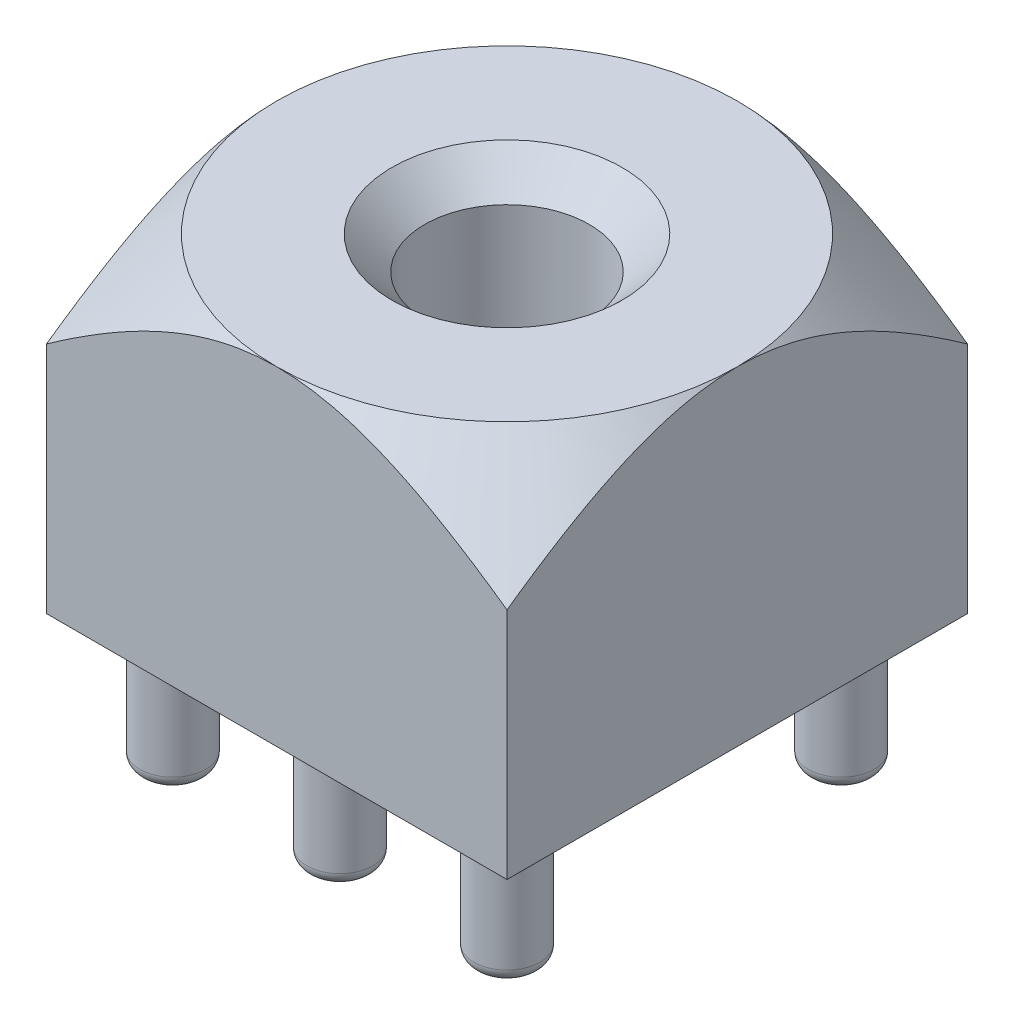
ISO-10303-21;
HEADER;
FILE_DESCRIPTION(('STEP AP214'),'2;1');
FILE_NAME('part.step','',(''),(''),'','','');
FILE_SCHEMA(('AUTOMOTIVE_DESIGN { 1 0 10303 214 1 1 1 1 }'));
ENDSEC;
DATA;
#1=APPLICATION_CONTEXT('core data for automotive mechanical design processes');
#2=APPLICATION_PROTOCOL_DEFINITION('international standard','automotive_design',2000,#1);
#3=PRODUCT_CONTEXT('',#1,'mechanical');
#4=PRODUCT('Part','Part','',(#3));
#5=PRODUCT_RELATED_PRODUCT_CATEGORY('part','',(#4));
#6=PRODUCT_DEFINITION_FORMATION('','',#4);
#7=PRODUCT_DEFINITION_CONTEXT('part definition',#1,'design');
#8=PRODUCT_DEFINITION('design','',#6,#7);
#9=PRODUCT_DEFINITION_SHAPE('','',#8);
#10=(LENGTH_UNIT() NAMED_UNIT(*) SI_UNIT(.MILLI.,.METRE.));
#11=(NAMED_UNIT(*) PLANE_ANGLE_UNIT() SI_UNIT($,.RADIAN.));
#12=(NAMED_UNIT(*) SI_UNIT($,.STERADIAN.) SOLID_ANGLE_UNIT());
#13=UNCERTAINTY_MEASURE_WITH_UNIT(LENGTH_MEASURE(1.E-05),#10,'distance_accuracy_value','');
#14=(GEOMETRIC_REPRESENTATION_CONTEXT(3) GLOBAL_UNCERTAINTY_ASSIGNED_CONTEXT((#13)) GLOBAL_UNIT_ASSIGNED_CONTEXT((#10,
#11,#12)) REPRESENTATION_CONTEXT('',''));
#15=CARTESIAN_POINT('',(0.,0.,0.));
#16=DIRECTION('',(0.,0.,1.));
#17=DIRECTION('',(1.,0.,0.));
#18=AXIS2_PLACEMENT_3D('',#15,#16,#17);
#19=CARTESIAN_POINT('',(2.54,-7.,2.54));
#20=DIRECTION('',(0.,-1.,0.));
#21=DIRECTION('',(0.,0.,-1.));
#22=AXIS2_PLACEMENT_3D('',#19,#20,#21);
#23=PLANE('',#22);
#24=CARTESIAN_POINT('',(2.54,-7.,2.54));
#25=DIRECTION('',(0.,1.,0.));
#26=DIRECTION('',(0.,0.,1.));
#27=AXIS2_PLACEMENT_3D('',#24,#25,#26);
#28=CIRCLE('',#27,0.3);
#29=CARTESIAN_POINT('',(2.54,-7.,2.84));
#30=VERTEX_POINT('',#29);
#31=CARTESIAN_POINT('',(2.54,-7.,2.24));
#32=VERTEX_POINT('',#31);
#33=EDGE_CURVE('E494',#30,#32,#28,.T.);
#34=ORIENTED_EDGE('',*,*,#33,.F.);
#35=CARTESIAN_POINT('',(2.54,-7.,2.54));
#36=DIRECTION('',(0.,1.,0.));
#37=DIRECTION('',(0.,0.,-1.));
#38=AXIS2_PLACEMENT_3D('',#35,#36,#37);
#39=CIRCLE('',#38,0.3);
#40=EDGE_CURVE('E503',#32,#30,#39,.T.);
#41=ORIENTED_EDGE('',*,*,#40,.F.);
#42=EDGE_LOOP('',(#34,#41));
#43=FACE_BOUND('',#42,.T.);
#44=ADVANCED_FACE('F17',(#43),#23,.T.);
#45=CARTESIAN_POINT('',(-2.54,-7.,2.54));
#46=DIRECTION('',(0.,-1.,0.));
#47=DIRECTION('',(0.,0.,-1.));
#48=AXIS2_PLACEMENT_3D('',#45,#46,#47);
#49=PLANE('',#48);
#50=CARTESIAN_POINT('',(-2.54,-7.,2.54));
#51=DIRECTION('',(0.,1.,0.));
#52=DIRECTION('',(0.,0.,1.));
#53=AXIS2_PLACEMENT_3D('',#50,#51,#52);
#54=CIRCLE('',#53,0.3);
#55=CARTESIAN_POINT('',(-2.54,-7.,2.84));
#56=VERTEX_POINT('',#55);
#57=CARTESIAN_POINT('',(-2.54,-7.,2.24));
#58=VERTEX_POINT('',#57);
#59=EDGE_CURVE('E455',#56,#58,#54,.T.);
#60=ORIENTED_EDGE('',*,*,#59,.F.);
#61=CARTESIAN_POINT('',(-2.54,-7.,2.54));
#62=DIRECTION('',(0.,1.,0.));
#63=DIRECTION('',(0.,0.,-1.));
#64=AXIS2_PLACEMENT_3D('',#61,#62,#63);
#65=CIRCLE('',#64,0.3);
#66=EDGE_CURVE('E439',#58,#56,#65,.T.);
#67=ORIENTED_EDGE('',*,*,#66,.F.);
#68=EDGE_LOOP('',(#60,#67));
#69=FACE_BOUND('',#68,.T.);
#70=ADVANCED_FACE('F461',(#69),#49,.T.);
#71=CARTESIAN_POINT('',(0.,-7.,2.54));
#72=DIRECTION('',(0.,-1.,0.));
#73=DIRECTION('',(0.,0.,-1.));
#74=AXIS2_PLACEMENT_3D('',#71,#72,#73);
#75=PLANE('',#74);
#76=CARTESIAN_POINT('',(0.,-7.,2.54));
#77=DIRECTION('',(0.,1.,0.));
#78=DIRECTION('',(0.,0.,1.));
#79=AXIS2_PLACEMENT_3D('',#76,#77,#78);
#80=CIRCLE('',#79,0.3);
#81=CARTESIAN_POINT('',(0.,-7.,2.84));
#82=VERTEX_POINT('',#81);
#83=CARTESIAN_POINT('',(0.,-7.,2.24));
#84=VERTEX_POINT('',#83);
#85=EDGE_CURVE('E307',#82,#84,#80,.T.);
#86=ORIENTED_EDGE('',*,*,#85,.F.);
#87=CARTESIAN_POINT('',(0.,-7.,2.54));
#88=DIRECTION('',(0.,1.,0.));
#89=DIRECTION('',(0.,0.,-1.));
#90=AXIS2_PLACEMENT_3D('',#87,#88,#89);
#91=CIRCLE('',#90,0.3);
#92=EDGE_CURVE('E435',#84,#82,#91,.T.);
#93=ORIENTED_EDGE('',*,*,#92,.F.);
#94=EDGE_LOOP('',(#86,#93));
#95=FACE_BOUND('',#94,.T.);
#96=ADVANCED_FACE('F469',(#95),#75,.T.);
#97=CARTESIAN_POINT('',(0.,0.,0.));
#98=DIRECTION('',(0.,1.,0.));
#99=DIRECTION('',(0.,0.,1.));
#100=AXIS2_PLACEMENT_3D('',#97,#98,#99);
#101=CONICAL_SURFACE('',#100,1.74999999995862,0.785398163340605);
#102=CARTESIAN_POINT('',(0.,0.,0.));
#103=DIRECTION('',(0.,1.,0.));
#104=DIRECTION('',(0.,0.,1.));
#105=AXIS2_PLACEMENT_3D('',#102,#103,#104);
#106=CIRCLE('',#105,1.74999999995862);
#107=CARTESIAN_POINT('',(0.,0.,1.74999999995862));
#108=VERTEX_POINT('',#107);
#109=EDGE_CURVE('E514',#108,#108,#106,.F.);
#110=ORIENTED_EDGE('',*,*,#109,.F.);
#111=EDGE_LOOP('',(#110));
#112=FACE_BOUND('',#111,.T.);
#113=CARTESIAN_POINT('',(0.,-0.499999999999994,0.));
#114=DIRECTION('',(0.,1.,0.));
#115=DIRECTION('',(0.,0.,1.));
#116=AXIS2_PLACEMENT_3D('',#113,#114,#115);
#117=CIRCLE('',#116,1.24999999999999);
#118=CARTESIAN_POINT('',(0.,-0.499999999999994,1.24999999999999));
#119=VERTEX_POINT('',#118);
#120=EDGE_CURVE('E121',#119,#119,#117,.F.);
#121=ORIENTED_EDGE('',*,*,#120,.T.);
#122=EDGE_LOOP('',(#121));
#123=FACE_BOUND('',#122,.T.);
#124=ADVANCED_FACE('F725',(#112,#123),#101,.F.);
#125=CARTESIAN_POINT('',(-3.5,0.,3.5));
#126=DIRECTION('',(0.,1.,0.));
#127=DIRECTION('',(0.,0.,1.));
#128=AXIS2_PLACEMENT_3D('',#125,#126,#127);
#129=PLANE('',#128);
#130=CARTESIAN_POINT('',(0.,0.,0.));
#131=DIRECTION('',(0.,-1.,0.));
#132=DIRECTION('',(0.,0.,-1.));
#133=AXIS2_PLACEMENT_3D('',#130,#131,#132);
#134=CIRCLE('',#133,3.49999999997408);
#135=CARTESIAN_POINT('',(0.,-1.29599677224441E-11,-3.49999999998704));
#136=VERTEX_POINT('',#135);
#137=CARTESIAN_POINT('',(3.49999999998704,-1.29598728578973E-11,0.));
#138=VERTEX_POINT('',#137);
#139=EDGE_CURVE('E106',#136,#138,#134,.T.);
#140=ORIENTED_EDGE('',*,*,#139,.F.);
#141=CARTESIAN_POINT('',(0.,0.,0.));
#142=DIRECTION('',(0.,-1.,0.));
#143=DIRECTION('',(0.,0.,-1.));
#144=AXIS2_PLACEMENT_3D('',#141,#142,#143);
#145=CIRCLE('',#144,3.49999999997408);
#146=CARTESIAN_POINT('',(-3.49999999998704,-1.29599812781145E-11,0.));
#147=VERTEX_POINT('',#146);
#148=EDGE_CURVE('E127',#147,#136,#145,.T.);
#149=ORIENTED_EDGE('',*,*,#148,.F.);
#150=CARTESIAN_POINT('',(0.,0.,0.));
#151=DIRECTION('',(0.,-1.,0.));
#152=DIRECTION('',(0.,0.,-1.));
#153=AXIS2_PLACEMENT_3D('',#150,#151,#152);
#154=CIRCLE('',#153,3.49999999997408);
#155=CARTESIAN_POINT('',(0.,-1.29599677255874E-11,3.49999999998704));
#156=VERTEX_POINT('',#155);
#157=EDGE_CURVE('E124',#156,#147,#154,.T.);
#158=ORIENTED_EDGE('',*,*,#157,.F.);
#159=CARTESIAN_POINT('',(0.,0.,0.));
#160=DIRECTION('',(0.,-1.,0.));
#161=DIRECTION('',(0.,0.,-1.));
#162=AXIS2_PLACEMENT_3D('',#159,#160,#161);
#163=CIRCLE('',#162,3.49999999997408);
#164=EDGE_CURVE('E112',#138,#156,#163,.T.);
#165=ORIENTED_EDGE('',*,*,#164,.F.);
#166=EDGE_LOOP('',(#140,#149,#158,#165));
#167=FACE_BOUND('',#166,.T.);
#168=ORIENTED_EDGE('',*,*,#109,.T.);
#169=EDGE_LOOP('',(#168));
#170=FACE_BOUND('',#169,.T.);
#171=ADVANCED_FACE('F125',(#167,#170),#129,.T.);
#172=CARTESIAN_POINT('',(0.,-7.,-2.54));
#173=DIRECTION('',(0.,1.,0.));
#174=DIRECTION('',(0.,0.,1.));
#175=AXIS2_PLACEMENT_3D('',#172,#173,#174);
#176=PLANE('',#175);
#177=CARTESIAN_POINT('',(0.,-7.,-2.54));
#178=DIRECTION('',(0.,1.,0.));
#179=DIRECTION('',(0.,0.,1.));
#180=AXIS2_PLACEMENT_3D('',#177,#178,#179);
#181=CIRCLE('',#180,0.3);
#182=CARTESIAN_POINT('',(0.,-7.,-2.24));
#183=VERTEX_POINT('',#182);
#184=CARTESIAN_POINT('',(0.,-7.,-2.84));
#185=VERTEX_POINT('',#184);
#186=EDGE_CURVE('E294',#183,#185,#181,.T.);
#187=ORIENTED_EDGE('',*,*,#186,.F.);
#188=CARTESIAN_POINT('',(0.,-7.,-2.54));
#189=DIRECTION('',(0.,1.,0.));
#190=DIRECTION('',(0.,0.,-1.));
#191=AXIS2_PLACEMENT_3D('',#188,#189,#190);
#192=CIRCLE('',#191,0.3);
#193=EDGE_CURVE('E132',#185,#183,#192,.T.);
#194=ORIENTED_EDGE('',*,*,#193,.F.);
#195=EDGE_LOOP('',(#187,#194));
#196=FACE_BOUND('',#195,.T.);
#197=ADVANCED_FACE('F709',(#196),#176,.F.);
#198=CARTESIAN_POINT('',(-2.54,-7.,-2.54));
#199=DIRECTION('',(0.,1.,0.));
#200=DIRECTION('',(0.,0.,1.));
#201=AXIS2_PLACEMENT_3D('',#198,#199,#200);
#202=PLANE('',#201);
#203=CARTESIAN_POINT('',(-2.54,-7.,-2.54));
#204=DIRECTION('',(0.,1.,0.));
#205=DIRECTION('',(0.,0.,1.));
#206=AXIS2_PLACEMENT_3D('',#203,#204,#205);
#207=CIRCLE('',#206,0.3);
#208=CARTESIAN_POINT('',(-2.54,-7.,-2.24));
#209=VERTEX_POINT('',#208);
#210=CARTESIAN_POINT('',(-2.54,-7.,-2.84));
#211=VERTEX_POINT('',#210);
#212=EDGE_CURVE('E281',#209,#211,#207,.T.);
#213=ORIENTED_EDGE('',*,*,#212,.F.);
#214=CARTESIAN_POINT('',(-2.54,-7.,-2.54));
#215=DIRECTION('',(0.,1.,0.));
#216=DIRECTION('',(0.,0.,-1.));
#217=AXIS2_PLACEMENT_3D('',#214,#215,#216);
#218=CIRCLE('',#217,0.3);
#219=EDGE_CURVE('E819',#211,#209,#218,.T.);
#220=ORIENTED_EDGE('',*,*,#219,.F.);
#221=EDGE_LOOP('',(#213,#220));
#222=FACE_BOUND('',#221,.T.);
#223=ADVANCED_FACE('F701',(#222),#202,.F.);
#224=CARTESIAN_POINT('',(2.54,-7.,-2.54));
#225=DIRECTION('',(0.,1.,0.));
#226=DIRECTION('',(0.,0.,1.));
#227=AXIS2_PLACEMENT_3D('',#224,#225,#226);
#228=PLANE('',#227);
#229=CARTESIAN_POINT('',(2.54,-7.,-2.54));
#230=DIRECTION('',(0.,1.,0.));
#231=DIRECTION('',(0.,0.,1.));
#232=AXIS2_PLACEMENT_3D('',#229,#230,#231);
#233=CIRCLE('',#232,0.3);
#234=CARTESIAN_POINT('',(2.54,-7.,-2.24));
#235=VERTEX_POINT('',#234);
#236=CARTESIAN_POINT('',(2.54,-7.,-2.84));
#237=VERTEX_POINT('',#236);
#238=EDGE_CURVE('E512',#235,#237,#233,.T.);
#239=ORIENTED_EDGE('',*,*,#238,.F.);
#240=CARTESIAN_POINT('',(2.54,-7.,-2.54));
#241=DIRECTION('',(0.,1.,0.));
#242=DIRECTION('',(0.,0.,-1.));
#243=AXIS2_PLACEMENT_3D('',#240,#241,#242);
#244=CIRCLE('',#243,0.3);
#245=EDGE_CURVE('E339',#237,#235,#244,.T.);
#246=ORIENTED_EDGE('',*,*,#245,.F.);
#247=EDGE_LOOP('',(#239,#246));
#248=FACE_BOUND('',#247,.T.);
#249=ADVANCED_FACE('F348',(#248),#228,.F.);
#250=CARTESIAN_POINT('',(2.54,-6.8,2.54));
#251=DIRECTION('',(0.,-1.,0.));
#252=DIRECTION('',(0.,0.,-1.));
#253=AXIS2_PLACEMENT_3D('',#250,#251,#252);
#254=TOROIDAL_SURFACE('',#253,0.3,0.2);
#255=CARTESIAN_POINT('',(2.54,-6.8,2.54));
#256=DIRECTION('',(0.,1.,0.));
#257=DIRECTION('',(0.,0.,1.));
#258=AXIS2_PLACEMENT_3D('',#255,#256,#257);
#259=CIRCLE('',#258,0.5);
#260=CARTESIAN_POINT('',(2.54,-6.8,3.04));
#261=VERTEX_POINT('',#260);
#262=EDGE_CURVE('E334',#261,#261,#259,.T.);
#263=ORIENTED_EDGE('',*,*,#262,.F.);
#264=EDGE_LOOP('',(#263));
#265=FACE_BOUND('',#264,.T.);
#266=ORIENTED_EDGE('',*,*,#40,.T.);
#267=ORIENTED_EDGE('',*,*,#33,.T.);
#268=EDGE_LOOP('',(#266,#267));
#269=FACE_BOUND('',#268,.T.);
#270=ADVANCED_FACE('F344',(#265,#269),#254,.T.);
#271=CARTESIAN_POINT('',(-2.54,-6.8,2.54));
#272=DIRECTION('',(0.,-1.,0.));
#273=DIRECTION('',(0.,0.,-1.));
#274=AXIS2_PLACEMENT_3D('',#271,#272,#273);
#275=TOROIDAL_SURFACE('',#274,0.3,0.2);
#276=CARTESIAN_POINT('',(-2.54,-6.8,2.54));
#277=DIRECTION('',(0.,1.,0.));
#278=DIRECTION('',(0.,0.,1.));
#279=AXIS2_PLACEMENT_3D('',#276,#277,#278);
#280=CIRCLE('',#279,0.5);
#281=CARTESIAN_POINT('',(-2.54,-6.8,3.04));
#282=VERTEX_POINT('',#281);
#283=EDGE_CURVE('E332',#282,#282,#280,.T.);
#284=ORIENTED_EDGE('',*,*,#283,.F.);
#285=EDGE_LOOP('',(#284));
#286=FACE_BOUND('',#285,.T.);
#287=ORIENTED_EDGE('',*,*,#66,.T.);
#288=ORIENTED_EDGE('',*,*,#59,.T.);
#289=EDGE_LOOP('',(#287,#288));
#290=FACE_BOUND('',#289,.T.);
#291=ADVANCED_FACE('F323',(#286,#290),#275,.T.);
#292=CARTESIAN_POINT('',(0.,-6.8,2.54));
#293=DIRECTION('',(0.,-1.,0.));
#294=DIRECTION('',(0.,0.,-1.));
#295=AXIS2_PLACEMENT_3D('',#292,#293,#294);
#296=TOROIDAL_SURFACE('',#295,0.3,0.2);
#297=CARTESIAN_POINT('',(0.,-6.8,2.54));
#298=DIRECTION('',(0.,1.,0.));
#299=DIRECTION('',(0.,0.,1.));
#300=AXIS2_PLACEMENT_3D('',#297,#298,#299);
#301=CIRCLE('',#300,0.5);
#302=CARTESIAN_POINT('',(0.,-6.8,3.04));
#303=VERTEX_POINT('',#302);
#304=EDGE_CURVE('E147',#303,#303,#301,.T.);
#305=ORIENTED_EDGE('',*,*,#304,.F.);
#306=EDGE_LOOP('',(#305));
#307=FACE_BOUND('',#306,.T.);
#308=ORIENTED_EDGE('',*,*,#92,.T.);
#309=ORIENTED_EDGE('',*,*,#85,.T.);
#310=EDGE_LOOP('',(#308,#309));
#311=FACE_BOUND('',#310,.T.);
#312=ADVANCED_FACE('F313',(#307,#311),#296,.T.);
#313=CARTESIAN_POINT('',(0.,0.,0.));
#314=DIRECTION('',(0.,1.,0.));
#315=DIRECTION('',(0.,0.,1.));
#316=AXIS2_PLACEMENT_3D('',#313,#314,#315);
#317=CYLINDRICAL_SURFACE('',#316,1.24999999999999);
#318=ORIENTED_EDGE('',*,*,#120,.F.);
#319=EDGE_LOOP('',(#318));
#320=FACE_BOUND('',#319,.T.);
#321=CARTESIAN_POINT('',(0.,-4.50000000000728,0.));
#322=DIRECTION('',(0.,-1.,0.));
#323=DIRECTION('',(0.,0.,-1.));
#324=AXIS2_PLACEMENT_3D('',#321,#322,#323);
#325=CIRCLE('',#324,1.24999999997044);
#326=CARTESIAN_POINT('',(0.,-4.50000000000728,-1.24999999997044));
#327=VERTEX_POINT('',#326);
#328=EDGE_CURVE('E144',#327,#327,#325,.T.);
#329=ORIENTED_EDGE('',*,*,#328,.T.);
#330=EDGE_LOOP('',(#329));
#331=FACE_BOUND('',#330,.T.);
#332=ADVANCED_FACE('F228',(#320,#331),#317,.F.);
#333=CARTESIAN_POINT('',(0.,-1.45844589394528,0.));
#334=DIRECTION('',(0.,-1.,0.));
#335=DIRECTION('',(0.,0.,-1.));
#336=AXIS2_PLACEMENT_3D('',#333,#334,#335);
#337=CONICAL_SURFACE('',#336,4.95844589391936,0.785398163397448);
#338=ORIENTED_EDGE('',*,*,#164,.T.);
#339=CARTESIAN_POINT('',(3.49999999998901,-1.44974746832139,3.50000000000366));
#340=CARTESIAN_POINT('',(3.39821366399818,-1.37780035224566,3.50000000000132));
#341=CARTESIAN_POINT('',(3.29569972899953,-1.30685700247901,3.50000000000035));
#342=CARTESIAN_POINT('',(3.08889737231007,-1.16748097128362,3.49999999999965));
#343=CARTESIAN_POINT('',(2.9846079761707,-1.09904973819861,3.4999999999999));
#344=CARTESIAN_POINT('',(2.77268890202154,-0.964419059791529,3.5000000000001));
#345=CARTESIAN_POINT('',(2.66503346830753,-0.898259921312427,3.50000000000003));
#346=CARTESIAN_POINT('',(2.44740446526764,-0.769901453770757,3.49999999999997));
#347=CARTESIAN_POINT('',(2.33743130242969,-0.707701437916691,3.49999999999999));
#348=CARTESIAN_POINT('',(2.12018775598007,-0.591114496218378,3.50000000000001));
#349=CARTESIAN_POINT('',(2.01304365925041,-0.536495241185325,3.5));
#350=CARTESIAN_POINT('',(1.79611690713829,-0.432802357168697,3.5));
#351=CARTESIAN_POINT('',(1.68633373209592,-0.383729831417964,3.5));
#352=CARTESIAN_POINT('',(1.35377147329278,-0.247279642952584,3.5));
#353=CARTESIAN_POINT('',(1.12649455380514,-0.169945901936522,3.5));
#354=CARTESIAN_POINT('',(0.821873706040195,-0.0945117383772291,3.5));
#355=CARTESIAN_POINT('',(0.748833760110536,-0.078483862848356,3.5));
#356=CARTESIAN_POINT('',(0.601913605519759,-0.0506478126324783,3.5));
#357=CARTESIAN_POINT('',(0.52803311786151,-0.0388410838696342,3.5));
#358=CARTESIAN_POINT('',(0.378634177556263,-0.0196321814308574,3.5));
#359=CARTESIAN_POINT('',(0.303107346656419,-0.012294763165499,3.5));
#360=CARTESIAN_POINT('',(0.15172403513332,-0.00246621394792665,3.5));
#361=CARTESIAN_POINT('',(0.0758674857147034,2.38516451155393E-05,3.5));
#362=CARTESIAN_POINT('',(0.,-2.59199354511748E-11,3.5));
#363=B_SPLINE_CURVE_WITH_KNOTS('',3,(#339,#340,#341,#342,#343,#344,#345,#346,#347,#348,#349,
#350,#351,#352,#353,#354,#355,#356,#357,#358,#359,#360,#361,#362),.UNSPECIFIED.,.F.,.F.,(4,2,2,
2,2,2,2,2,2,2,2,4),(0.,0.373956315625962,0.748124951283451,1.12713244375188,1.50607400935597,
1.86669950750992,2.22739660757048,2.94438584933716,3.16862561909834,3.39294212718864,
3.62043588456647,3.84797963525539),.UNSPECIFIED.);
#364=CARTESIAN_POINT('',(3.49999999999389,-1.44974746832312,3.49999999999389));
#365=VERTEX_POINT('',#364);
#366=EDGE_CURVE('E116',#365,#156,#363,.T.);
#367=ORIENTED_EDGE('',*,*,#366,.F.);
#368=CARTESIAN_POINT('',(3.49999999999972,-2.6035221149101E-11,0.));
#369=CARTESIAN_POINT('',(3.4999999999999,4.33696277378889E-06,0.0538257844292777));
#370=CARTESIAN_POINT('',(3.49999999999997,-0.0012422869313447,0.107643621697161));
#371=CARTESIAN_POINT('',(3.50000000000003,-0.00619664854182487,0.215157300769825));
#372=CARTESIAN_POINT('',(3.50000000000001,-0.00990398159182181,0.268853161177188));
#373=CARTESIAN_POINT('',(3.49999999999998,-0.024635654236718,0.429398312351436));
#374=CARTESIAN_POINT('',(3.49999999999999,-0.0392700143895498,0.535933882124228));
#375=CARTESIAN_POINT('',(3.5,-0.0770591104708806,0.745527314073712));
#376=CARTESIAN_POINT('',(3.5,-0.100061025718745,0.848613430183671));
#377=CARTESIAN_POINT('',(3.5,-0.153589285824711,1.05281836225844));
#378=CARTESIAN_POINT('',(3.5,-0.184117797211359,1.15393660271249));
#379=CARTESIAN_POINT('',(3.5,-0.284977479615344,1.45299931472575));
#380=CARTESIAN_POINT('',(3.5,-0.364801519252051,1.6477420014703));
#381=CARTESIAN_POINT('',(3.5,-0.542194396751578,2.02929282280307));
#382=CARTESIAN_POINT('',(3.5,-0.639810487929897,2.21607815372315));
#383=CARTESIAN_POINT('',(3.5,-0.79731880414583,2.49460541703386));
#384=CARTESIAN_POINT('',(3.5,-0.852799998704405,2.58889107922255));
#385=CARTESIAN_POINT('',(3.5,-0.966499302591495,2.77581209699288));
#386=CARTESIAN_POINT('',(3.5,-1.02471768030848,2.86844728950818));
#387=CARTESIAN_POINT('',(3.5,-1.14302138609713,3.05164052694075));
#388=CARTESIAN_POINT('',(3.5,-1.20309176629999,3.14220827489108));
#389=CARTESIAN_POINT('',(3.5,-1.32510037456839,3.32203533932879));
#390=CARTESIAN_POINT('',(3.5,-1.38703798842321,3.41129507202436));
#391=CARTESIAN_POINT('',(3.5,-1.44974746832348,3.4999999999883));
#392=B_SPLINE_CURVE_WITH_KNOTS('',3,(#368,#369,#370,#371,#372,#373,#374,#375,#376,#377,#378,
#379,#380,#381,#382,#383,#384,#385,#386,#387,#388,#389,#390,#391),.UNSPECIFIED.,.F.,.F.,(4,2,2,
2,2,2,2,2,2,2,2,4),(0.,0.16144773601695,0.322868928349694,0.645027775478174,0.961576226455418,
1.27821590241675,1.90818719801281,2.53985666095458,2.86801209349753,3.1961997699784,
3.52221020814164,3.8481145535385),.UNSPECIFIED.);
#393=EDGE_CURVE('E118',#138,#365,#392,.T.);
#394=ORIENTED_EDGE('',*,*,#393,.F.);
#395=EDGE_LOOP('',(#338,#367,#394));
#396=FACE_BOUND('',#395,.T.);
#397=ADVANCED_FACE('F114',(#396),#337,.T.);
#398=CARTESIAN_POINT('',(0.,-1.45844589394528,0.));
#399=DIRECTION('',(0.,-1.,0.));
#400=DIRECTION('',(0.,0.,-1.));
#401=AXIS2_PLACEMENT_3D('',#398,#399,#400);
#402=CONICAL_SURFACE('',#401,4.95844589391936,0.785398163397448);
#403=ORIENTED_EDGE('',*,*,#139,.T.);
#404=CARTESIAN_POINT('',(3.50000000000366,-1.44974746832139,-3.49999999998901));
#405=CARTESIAN_POINT('',(3.50000000000132,-1.37780035224566,-3.39821366399818));
#406=CARTESIAN_POINT('',(3.50000000000035,-1.30685700247901,-3.29569972899953));
#407=CARTESIAN_POINT('',(3.49999999999965,-1.16748097128362,-3.08889737231007));
#408=CARTESIAN_POINT('',(3.4999999999999,-1.09904973819861,-2.9846079761707));
#409=CARTESIAN_POINT('',(3.5000000000001,-0.964419059791529,-2.77268890202154));
#410=CARTESIAN_POINT('',(3.50000000000003,-0.898259921312427,-2.66503346830753));
#411=CARTESIAN_POINT('',(3.49999999999997,-0.769901453770757,-2.44740446526764));
#412=CARTESIAN_POINT('',(3.49999999999999,-0.707701437916691,-2.33743130242969));
#413=CARTESIAN_POINT('',(3.50000000000001,-0.591114496218377,-2.12018775598007));
#414=CARTESIAN_POINT('',(3.5,-0.536495241185325,-2.01304365925041));
#415=CARTESIAN_POINT('',(3.5,-0.432802357168697,-1.79611690713829));
#416=CARTESIAN_POINT('',(3.5,-0.383729831417964,-1.68633373209592));
#417=CARTESIAN_POINT('',(3.5,-0.247279642952584,-1.35377147329278));
#418=CARTESIAN_POINT('',(3.5,-0.169945901936522,-1.12649455380513));
#419=CARTESIAN_POINT('',(3.5,-0.0945117383772291,-0.821873706040195));
#420=CARTESIAN_POINT('',(3.5,-0.078483862848356,-0.748833760110536));
#421=CARTESIAN_POINT('',(3.5,-0.0506478126324783,-0.601913605519759));
#422=CARTESIAN_POINT('',(3.5,-0.038841083869634,-0.528033117861509));
#423=CARTESIAN_POINT('',(3.5,-0.0196321814308573,-0.378634177556263));
#424=CARTESIAN_POINT('',(3.5,-0.0122947631654991,-0.303107346656419));
#425=CARTESIAN_POINT('',(3.5,-0.00246621394792686,-0.15172403513332));
#426=CARTESIAN_POINT('',(3.5,2.38516451153835E-05,-0.0758674857147033));
#427=CARTESIAN_POINT('',(3.5,-2.59197457157946E-11,0.));
#428=B_SPLINE_CURVE_WITH_KNOTS('',3,(#404,#405,#406,#407,#408,#409,#410,#411,#412,#413,#414,
#415,#416,#417,#418,#419,#420,#421,#422,#423,#424,#425,#426,#427),.UNSPECIFIED.,.F.,.F.,(4,2,2,
2,2,2,2,2,2,2,2,4),(0.,0.373956315625962,0.748124951283451,1.12713244375188,1.50607400935597,
1.86669950750992,2.22739660757048,2.94438584933716,3.16862561909834,3.39294212718864,
3.62043588456647,3.84797963525539),.UNSPECIFIED.);
#429=CARTESIAN_POINT('',(3.49999999999389,-1.44974746832312,-3.49999999999389));
#430=VERTEX_POINT('',#429);
#431=EDGE_CURVE('E217',#430,#138,#428,.T.);
#432=ORIENTED_EDGE('',*,*,#431,.F.);
#433=CARTESIAN_POINT('',(0.,-2.6035221149101E-11,-3.49999999999972));
#434=CARTESIAN_POINT('',(0.0538257844292778,4.33696277377694E-06,-3.4999999999999));
#435=CARTESIAN_POINT('',(0.107643621697161,-0.0012422869313447,-3.49999999999997));
#436=CARTESIAN_POINT('',(0.215157300769825,-0.00619664854182483,-3.50000000000003));
#437=CARTESIAN_POINT('',(0.268853161177188,-0.00990398159182175,-3.50000000000001));
#438=CARTESIAN_POINT('',(0.429398312351436,-0.0246356542367179,-3.49999999999998));
#439=CARTESIAN_POINT('',(0.535933882124228,-0.0392700143895496,-3.49999999999999));
#440=CARTESIAN_POINT('',(0.745527314073712,-0.0770591104708805,-3.5));
#441=CARTESIAN_POINT('',(0.848613430183672,-0.100061025718745,-3.5));
#442=CARTESIAN_POINT('',(1.05281836225844,-0.153589285824711,-3.5));
#443=CARTESIAN_POINT('',(1.15393660271249,-0.184117797211359,-3.5));
#444=CARTESIAN_POINT('',(1.45299931472575,-0.284977479615344,-3.5));
#445=CARTESIAN_POINT('',(1.6477420014703,-0.364801519252051,-3.5));
#446=CARTESIAN_POINT('',(2.02929282280307,-0.542194396751578,-3.5));
#447=CARTESIAN_POINT('',(2.21607815372315,-0.639810487929898,-3.5));
#448=CARTESIAN_POINT('',(2.49460541703386,-0.79731880414583,-3.5));
#449=CARTESIAN_POINT('',(2.58889107922255,-0.852799998704405,-3.5));
#450=CARTESIAN_POINT('',(2.77581209699288,-0.966499302591495,-3.5));
#451=CARTESIAN_POINT('',(2.86844728950818,-1.02471768030848,-3.5));
#452=CARTESIAN_POINT('',(3.05164052694075,-1.14302138609713,-3.5));
#453=CARTESIAN_POINT('',(3.14220827489108,-1.20309176629999,-3.5));
#454=CARTESIAN_POINT('',(3.32203533932879,-1.32510037456839,-3.5));
#455=CARTESIAN_POINT('',(3.41129507202436,-1.38703798842321,-3.5));
#456=CARTESIAN_POINT('',(3.4999999999883,-1.44974746832348,-3.5));
#457=B_SPLINE_CURVE_WITH_KNOTS('',3,(#433,#434,#435,#436,#437,#438,#439,#440,#441,#442,#443,
#444,#445,#446,#447,#448,#449,#450,#451,#452,#453,#454,#455,#456),.UNSPECIFIED.,.F.,.F.,(4,2,2,
2,2,2,2,2,2,2,2,4),(0.,0.16144773601695,0.322868928349695,0.645027775478174,0.961576226455418,
1.27821590241675,1.90818719801281,2.53985666095458,2.86801209349753,3.1961997699784,
3.52221020814164,3.8481145535385),.UNSPECIFIED.);
#458=EDGE_CURVE('E211',#136,#430,#457,.T.);
#459=ORIENTED_EDGE('',*,*,#458,.F.);
#460=EDGE_LOOP('',(#403,#432,#459));
#461=FACE_BOUND('',#460,.T.);
#462=ADVANCED_FACE('F221',(#461),#402,.T.);
#463=CARTESIAN_POINT('',(0.,-1.45844589388844,0.));
#464=DIRECTION('',(0.,-1.,0.));
#465=DIRECTION('',(0.,0.,-1.));
#466=AXIS2_PLACEMENT_3D('',#463,#464,#465);
#467=CONICAL_SURFACE('',#466,4.95844589386252,0.785398163397448);
#468=CARTESIAN_POINT('',(-3.49999999999972,-2.60349593995421E-11,0.));
#469=CARTESIAN_POINT('',(-3.4999999999999,4.3369627741059E-06,-0.0538257844292776));
#470=CARTESIAN_POINT('',(-3.49999999999997,-0.00124228693134443,-0.107643621697161));
#471=CARTESIAN_POINT('',(-3.50000000000003,-0.00619664854182472,-0.215157300769824));
#472=CARTESIAN_POINT('',(-3.50000000000001,-0.00990398159182172,-0.268853161177188));
#473=CARTESIAN_POINT('',(-3.49999999999998,-0.0246356542367178,-0.429398312351436));
#474=CARTESIAN_POINT('',(-3.49999999999999,-0.0392700143895491,-0.535933882124228));
#475=CARTESIAN_POINT('',(-3.5,-0.07705911047088,-0.745527314073712));
#476=CARTESIAN_POINT('',(-3.5,-0.100061025718745,-0.848613430183671));
#477=CARTESIAN_POINT('',(-3.5,-0.153589285824711,-1.05281836225844));
#478=CARTESIAN_POINT('',(-3.5,-0.184117797211359,-1.15393660271249));
#479=CARTESIAN_POINT('',(-3.5,-0.284977479615344,-1.45299931472575));
#480=CARTESIAN_POINT('',(-3.5,-0.364801519252051,-1.6477420014703));
#481=CARTESIAN_POINT('',(-3.5,-0.542194396751578,-2.02929282280307));
#482=CARTESIAN_POINT('',(-3.5,-0.639810487929897,-2.21607815372315));
#483=CARTESIAN_POINT('',(-3.5,-0.79731880414583,-2.49460541703386));
#484=CARTESIAN_POINT('',(-3.5,-0.852799998704405,-2.58889107922255));
#485=CARTESIAN_POINT('',(-3.5,-0.966499302591495,-2.77581209699288));
#486=CARTESIAN_POINT('',(-3.5,-1.02471768030848,-2.86844728950818));
#487=CARTESIAN_POINT('',(-3.5,-1.14302138609713,-3.05164052694075));
#488=CARTESIAN_POINT('',(-3.5,-1.20309176629999,-3.14220827489108));
#489=CARTESIAN_POINT('',(-3.5,-1.32510037456839,-3.32203533932879));
#490=CARTESIAN_POINT('',(-3.5,-1.38703798842321,-3.41129507202436));
#491=CARTESIAN_POINT('',(-3.5,-1.44974746832348,-3.4999999999883));
#492=B_SPLINE_CURVE_WITH_KNOTS('',3,(#468,#469,#470,#471,#472,#473,#474,#475,#476,#477,#478,
#479,#480,#481,#482,#483,#484,#485,#486,#487,#488,#489,#490,#491),.UNSPECIFIED.,.F.,.F.,(4,2,2,
2,2,2,2,2,2,2,2,4),(0.,0.16144773601695,0.322868928349694,0.645027775478174,0.961576226455418,
1.27821590241675,1.90818719801281,2.53985666095458,2.86801209349753,3.1961997699784,
3.52221020814164,3.8481145535385),.UNSPECIFIED.);
#493=CARTESIAN_POINT('',(-3.49999999999389,-1.44974746832312,-3.49999999999389));
#494=VERTEX_POINT('',#493);
#495=EDGE_CURVE('E186',#147,#494,#492,.T.);
#496=ORIENTED_EDGE('',*,*,#495,.F.);
#497=ORIENTED_EDGE('',*,*,#148,.T.);
#498=CARTESIAN_POINT('',(-3.49999999998901,-1.44974746832139,-3.50000000000366));
#499=CARTESIAN_POINT('',(-3.39821366399818,-1.37780035224566,-3.50000000000132));
#500=CARTESIAN_POINT('',(-3.29569972899953,-1.30685700247901,-3.50000000000035));
#501=CARTESIAN_POINT('',(-3.08889737231007,-1.16748097128362,-3.49999999999965));
#502=CARTESIAN_POINT('',(-2.9846079761707,-1.09904973819861,-3.4999999999999));
#503=CARTESIAN_POINT('',(-2.77268890202154,-0.964419059791529,-3.5000000000001));
#504=CARTESIAN_POINT('',(-2.66503346830753,-0.898259921312427,-3.50000000000003));
#505=CARTESIAN_POINT('',(-2.44740446526764,-0.769901453770757,-3.49999999999997));
#506=CARTESIAN_POINT('',(-2.33743130242969,-0.707701437916691,-3.49999999999999));
#507=CARTESIAN_POINT('',(-2.12018775598007,-0.591114496218377,-3.50000000000001));
#508=CARTESIAN_POINT('',(-2.01304365925041,-0.536495241185325,-3.5));
#509=CARTESIAN_POINT('',(-1.79611690713829,-0.432802357168697,-3.5));
#510=CARTESIAN_POINT('',(-1.68633373209592,-0.383729831417964,-3.5));
#511=CARTESIAN_POINT('',(-1.35377147329278,-0.247279642952585,-3.5));
#512=CARTESIAN_POINT('',(-1.12649455380514,-0.169945901936521,-3.5));
#513=CARTESIAN_POINT('',(-0.821873706040195,-0.0945117383772292,-3.5));
#514=CARTESIAN_POINT('',(-0.748833760110536,-0.0784838628483562,-3.5));
#515=CARTESIAN_POINT('',(-0.601913605519759,-0.0506478126324784,-3.5));
#516=CARTESIAN_POINT('',(-0.52803311786151,-0.038841083869634,-3.5));
#517=CARTESIAN_POINT('',(-0.378634177556263,-0.0196321814308569,-3.5));
#518=CARTESIAN_POINT('',(-0.303107346656419,-0.0122947631654986,-3.5));
#519=CARTESIAN_POINT('',(-0.15172403513332,-0.00246621394792645,-3.5));
#520=CARTESIAN_POINT('',(-0.0758674857147034,2.38516451156147E-05,-3.5));
#521=CARTESIAN_POINT('',(0.,-2.59199354448881E-11,-3.5));
#522=B_SPLINE_CURVE_WITH_KNOTS('',3,(#498,#499,#500,#501,#502,#503,#504,#505,#506,#507,#508,
#509,#510,#511,#512,#513,#514,#515,#516,#517,#518,#519,#520,#521),.UNSPECIFIED.,.F.,.F.,(4,2,2,
2,2,2,2,2,2,2,2,4),(0.,0.373956315625962,0.748124951283451,1.12713244375188,1.50607400935597,
1.86669950750992,2.22739660757048,2.94438584933716,3.16862561909833,3.39294212718864,
3.62043588456647,3.84797963525539),.UNSPECIFIED.);
#523=EDGE_CURVE('E206',#494,#136,#522,.T.);
#524=ORIENTED_EDGE('',*,*,#523,.F.);
#525=EDGE_LOOP('',(#496,#497,#524));
#526=FACE_BOUND('',#525,.T.);
#527=ADVANCED_FACE('F168',(#526),#467,.T.);
#528=CARTESIAN_POINT('',(0.,-1.45844589394528,0.));
#529=DIRECTION('',(0.,-1.,0.));
#530=DIRECTION('',(0.,0.,-1.));
#531=AXIS2_PLACEMENT_3D('',#528,#529,#530);
#532=CONICAL_SURFACE('',#531,4.95844589391936,0.785398163397448);
#533=CARTESIAN_POINT('',(0.,-2.6035221149101E-11,3.49999999999972));
#534=CARTESIAN_POINT('',(-0.0538257844292778,4.33696277377246E-06,3.4999999999999));
#535=CARTESIAN_POINT('',(-0.107643621697161,-0.00124228693134471,3.49999999999997));
#536=CARTESIAN_POINT('',(-0.215157300769825,-0.00619664854182485,3.50000000000003));
#537=CARTESIAN_POINT('',(-0.268853161177188,-0.00990398159182177,3.50000000000001));
#538=CARTESIAN_POINT('',(-0.429398312351436,-0.0246356542367179,3.49999999999998));
#539=CARTESIAN_POINT('',(-0.535933882124228,-0.0392700143895496,3.49999999999999));
#540=CARTESIAN_POINT('',(-0.745527314073712,-0.0770591104708806,3.5));
#541=CARTESIAN_POINT('',(-0.848613430183672,-0.100061025718745,3.5));
#542=CARTESIAN_POINT('',(-1.05281836225844,-0.153589285824711,3.5));
#543=CARTESIAN_POINT('',(-1.15393660271249,-0.184117797211359,3.5));
#544=CARTESIAN_POINT('',(-1.45299931472575,-0.284977479615344,3.5));
#545=CARTESIAN_POINT('',(-1.6477420014703,-0.364801519252051,3.5));
#546=CARTESIAN_POINT('',(-2.02929282280307,-0.542194396751578,3.5));
#547=CARTESIAN_POINT('',(-2.21607815372315,-0.639810487929898,3.5));
#548=CARTESIAN_POINT('',(-2.49460541703386,-0.79731880414583,3.5));
#549=CARTESIAN_POINT('',(-2.58889107922255,-0.852799998704405,3.5));
#550=CARTESIAN_POINT('',(-2.77581209699288,-0.966499302591495,3.5));
#551=CARTESIAN_POINT('',(-2.86844728950818,-1.02471768030848,3.5));
#552=CARTESIAN_POINT('',(-3.05164052694075,-1.14302138609713,3.5));
#553=CARTESIAN_POINT('',(-3.14220827489108,-1.20309176629999,3.5));
#554=CARTESIAN_POINT('',(-3.32203533932879,-1.32510037456839,3.5));
#555=CARTESIAN_POINT('',(-3.41129507202436,-1.38703798842321,3.5));
#556=CARTESIAN_POINT('',(-3.4999999999883,-1.44974746832348,3.5));
#557=B_SPLINE_CURVE_WITH_KNOTS('',3,(#533,#534,#535,#536,#537,#538,#539,#540,#541,#542,#543,
#544,#545,#546,#547,#548,#549,#550,#551,#552,#553,#554,#555,#556),.UNSPECIFIED.,.F.,.F.,(4,2,2,
2,2,2,2,2,2,2,2,4),(0.,0.16144773601695,0.322868928349695,0.645027775478174,0.961576226455418,
1.27821590241675,1.90818719801281,2.53985666095458,2.86801209349753,3.1961997699784,
3.52221020814164,3.8481145535385),.UNSPECIFIED.);
#558=CARTESIAN_POINT('',(-3.49999999999389,-1.44974746832744,3.5));
#559=VERTEX_POINT('',#558);
#560=EDGE_CURVE('E137',#156,#559,#557,.T.);
#561=ORIENTED_EDGE('',*,*,#560,.F.);
#562=ORIENTED_EDGE('',*,*,#157,.T.);
#563=CARTESIAN_POINT('',(-3.50000000000366,-1.44974746832139,3.49999999998901));
#564=CARTESIAN_POINT('',(-3.50000000000132,-1.37780035224566,3.39821366399818));
#565=CARTESIAN_POINT('',(-3.50000000000035,-1.30685700247901,3.29569972899953));
#566=CARTESIAN_POINT('',(-3.49999999999965,-1.16748097128362,3.08889737231007));
#567=CARTESIAN_POINT('',(-3.4999999999999,-1.09904973819861,2.9846079761707));
#568=CARTESIAN_POINT('',(-3.5000000000001,-0.964419059791529,2.77268890202154));
#569=CARTESIAN_POINT('',(-3.50000000000003,-0.898259921312427,2.66503346830753));
#570=CARTESIAN_POINT('',(-3.49999999999997,-0.769901453770757,2.44740446526764));
#571=CARTESIAN_POINT('',(-3.49999999999999,-0.707701437916691,2.33743130242969));
#572=CARTESIAN_POINT('',(-3.50000000000001,-0.591114496218377,2.12018775598007));
#573=CARTESIAN_POINT('',(-3.5,-0.536495241185325,2.01304365925041));
#574=CARTESIAN_POINT('',(-3.5,-0.432802357168697,1.79611690713829));
#575=CARTESIAN_POINT('',(-3.5,-0.383729831417964,1.68633373209592));
#576=CARTESIAN_POINT('',(-3.5,-0.247279642952584,1.35377147329278));
#577=CARTESIAN_POINT('',(-3.5,-0.169945901936522,1.12649455380514));
#578=CARTESIAN_POINT('',(-3.5,-0.0945117383772291,0.821873706040195));
#579=CARTESIAN_POINT('',(-3.5,-0.078483862848356,0.748833760110536));
#580=CARTESIAN_POINT('',(-3.5,-0.0506478126324782,0.601913605519759));
#581=CARTESIAN_POINT('',(-3.5,-0.038841083869634,0.52803311786151));
#582=CARTESIAN_POINT('',(-3.5,-0.0196321814308573,0.378634177556263));
#583=CARTESIAN_POINT('',(-3.5,-0.012294763165499,0.303107346656419));
#584=CARTESIAN_POINT('',(-3.5,-0.00246621394792681,0.15172403513332));
#585=CARTESIAN_POINT('',(-3.5,2.3851645115449E-05,0.0758674857147034));
#586=CARTESIAN_POINT('',(-3.5,-2.59196558975457E-11,0.));
#587=B_SPLINE_CURVE_WITH_KNOTS('',3,(#563,#564,#565,#566,#567,#568,#569,#570,#571,#572,#573,
#574,#575,#576,#577,#578,#579,#580,#581,#582,#583,#584,#585,#586),.UNSPECIFIED.,.F.,.F.,(4,2,2,
2,2,2,2,2,2,2,2,4),(0.,0.373956315625962,0.748124951283451,1.12713244375188,1.50607400935597,
1.86669950750992,2.22739660757048,2.94438584933716,3.16862561909833,3.39294212718864,
3.62043588456647,3.84797963525539),.UNSPECIFIED.);
#588=EDGE_CURVE('E143',#559,#147,#587,.T.);
#589=ORIENTED_EDGE('',*,*,#588,.F.);
#590=EDGE_LOOP('',(#561,#562,#589));
#591=FACE_BOUND('',#590,.T.);
#592=ADVANCED_FACE('F142',(#591),#532,.T.);
#593=CARTESIAN_POINT('',(0.,-6.8,-2.54));
#594=DIRECTION('',(0.,1.,0.));
#595=DIRECTION('',(0.,0.,1.));
#596=AXIS2_PLACEMENT_3D('',#593,#594,#595);
#597=TOROIDAL_SURFACE('',#596,0.3,0.2);
#598=ORIENTED_EDGE('',*,*,#186,.T.);
#599=ORIENTED_EDGE('',*,*,#193,.T.);
#600=EDGE_LOOP('',(#598,#599));
#601=FACE_BOUND('',#600,.T.);
#602=CARTESIAN_POINT('',(0.,-6.8,-2.54));
#603=DIRECTION('',(0.,1.,0.));
#604=DIRECTION('',(0.,0.,1.));
#605=AXIS2_PLACEMENT_3D('',#602,#603,#604);
#606=CIRCLE('',#605,0.5);
#607=CARTESIAN_POINT('',(0.,-6.8,-2.04));
#608=VERTEX_POINT('',#607);
#609=EDGE_CURVE('E182',#608,#608,#606,.T.);
#610=ORIENTED_EDGE('',*,*,#609,.F.);
#611=EDGE_LOOP('',(#610));
#612=FACE_BOUND('',#611,.T.);
#613=ADVANCED_FACE('F167',(#601,#612),#597,.T.);
#614=CARTESIAN_POINT('',(-2.54,-6.8,-2.54));
#615=DIRECTION('',(0.,1.,0.));
#616=DIRECTION('',(0.,0.,1.));
#617=AXIS2_PLACEMENT_3D('',#614,#615,#616);
#618=TOROIDAL_SURFACE('',#617,0.3,0.2);
#619=ORIENTED_EDGE('',*,*,#212,.T.);
#620=ORIENTED_EDGE('',*,*,#219,.T.);
#621=EDGE_LOOP('',(#619,#620));
#622=FACE_BOUND('',#621,.T.);
#623=CARTESIAN_POINT('',(-2.54,-6.8,-2.54));
#624=DIRECTION('',(0.,1.,0.));
#625=DIRECTION('',(0.,0.,1.));
#626=AXIS2_PLACEMENT_3D('',#623,#624,#625);
#627=CIRCLE('',#626,0.5);
#628=CARTESIAN_POINT('',(-2.54,-6.8,-2.04));
#629=VERTEX_POINT('',#628);
#630=EDGE_CURVE('E247',#629,#629,#627,.T.);
#631=ORIENTED_EDGE('',*,*,#630,.F.);
#632=EDGE_LOOP('',(#631));
#633=FACE_BOUND('',#632,.T.);
#634=ADVANCED_FACE('F257',(#622,#633),#618,.T.);
#635=CARTESIAN_POINT('',(2.54,-6.8,-2.54));
#636=DIRECTION('',(0.,1.,0.));
#637=DIRECTION('',(0.,0.,1.));
#638=AXIS2_PLACEMENT_3D('',#635,#636,#637);
#639=TOROIDAL_SURFACE('',#638,0.3,0.2);
#640=ORIENTED_EDGE('',*,*,#238,.T.);
#641=ORIENTED_EDGE('',*,*,#245,.T.);
#642=EDGE_LOOP('',(#640,#641));
#643=FACE_BOUND('',#642,.T.);
#644=CARTESIAN_POINT('',(2.54,-6.8,-2.54));
#645=DIRECTION('',(0.,1.,0.));
#646=DIRECTION('',(0.,0.,1.));
#647=AXIS2_PLACEMENT_3D('',#644,#645,#646);
#648=CIRCLE('',#647,0.5);
#649=CARTESIAN_POINT('',(2.54,-6.8,-2.04));
#650=VERTEX_POINT('',#649);
#651=EDGE_CURVE('E244',#650,#650,#648,.T.);
#652=ORIENTED_EDGE('',*,*,#651,.F.);
#653=EDGE_LOOP('',(#652));
#654=FACE_BOUND('',#653,.T.);
#655=ADVANCED_FACE('F252',(#643,#654),#639,.T.);
#656=CARTESIAN_POINT('',(2.54,-7.,2.54));
#657=DIRECTION('',(0.,1.,0.));
#658=DIRECTION('',(0.,0.,1.));
#659=AXIS2_PLACEMENT_3D('',#656,#657,#658);
#660=CYLINDRICAL_SURFACE('',#659,0.5);
#661=ORIENTED_EDGE('',*,*,#262,.T.);
#662=EDGE_LOOP('',(#661));
#663=FACE_BOUND('',#662,.T.);
#664=CARTESIAN_POINT('',(2.54,-5.,2.54));
#665=DIRECTION('',(0.,1.,0.));
#666=DIRECTION('',(0.,0.,1.));
#667=AXIS2_PLACEMENT_3D('',#664,#665,#666);
#668=CIRCLE('',#667,0.5);
#669=CARTESIAN_POINT('',(2.54,-5.,3.04));
#670=VERTEX_POINT('',#669);
#671=EDGE_CURVE('E184',#670,#670,#668,.F.);
#672=ORIENTED_EDGE('',*,*,#671,.T.);
#673=EDGE_LOOP('',(#672));
#674=FACE_BOUND('',#673,.T.);
#675=ADVANCED_FACE('F256',(#663,#674),#660,.T.);
#676=CARTESIAN_POINT('',(-2.54,-7.,2.54));
#677=DIRECTION('',(0.,1.,0.));
#678=DIRECTION('',(0.,0.,1.));
#679=AXIS2_PLACEMENT_3D('',#676,#677,#678);
#680=CYLINDRICAL_SURFACE('',#679,0.5);
#681=ORIENTED_EDGE('',*,*,#283,.T.);
#682=EDGE_LOOP('',(#681));
#683=FACE_BOUND('',#682,.T.);
#684=CARTESIAN_POINT('',(-2.54,-5.,2.54));
#685=DIRECTION('',(0.,1.,0.));
#686=DIRECTION('',(0.,0.,1.));
#687=AXIS2_PLACEMENT_3D('',#684,#685,#686);
#688=CIRCLE('',#687,0.5);
#689=CARTESIAN_POINT('',(-2.54,-5.,3.04));
#690=VERTEX_POINT('',#689);
#691=EDGE_CURVE('E377',#690,#690,#688,.F.);
#692=ORIENTED_EDGE('',*,*,#691,.T.);
#693=EDGE_LOOP('',(#692));
#694=FACE_BOUND('',#693,.T.);
#695=ADVANCED_FACE('F424',(#683,#694),#680,.T.);
#696=CARTESIAN_POINT('',(0.,-7.,2.54));
#697=DIRECTION('',(0.,1.,0.));
#698=DIRECTION('',(0.,0.,1.));
#699=AXIS2_PLACEMENT_3D('',#696,#697,#698);
#700=CYLINDRICAL_SURFACE('',#699,0.5);
#701=ORIENTED_EDGE('',*,*,#304,.T.);
#702=EDGE_LOOP('',(#701));
#703=FACE_BOUND('',#702,.T.);
#704=CARTESIAN_POINT('',(0.,-5.,2.54));
#705=DIRECTION('',(0.,1.,0.));
#706=DIRECTION('',(0.,0.,1.));
#707=AXIS2_PLACEMENT_3D('',#704,#705,#706);
#708=CIRCLE('',#707,0.5);
#709=CARTESIAN_POINT('',(0.,-5.,3.04));
#710=VERTEX_POINT('',#709);
#711=EDGE_CURVE('E375',#710,#710,#708,.F.);
#712=ORIENTED_EDGE('',*,*,#711,.T.);
#713=EDGE_LOOP('',(#712));
#714=FACE_BOUND('',#713,.T.);
#715=ADVANCED_FACE('F421',(#703,#714),#700,.T.);
#716=CARTESIAN_POINT('',(0.,-4.99999999999545,0.));
#717=DIRECTION('',(0.,-1.,0.));
#718=DIRECTION('',(0.,0.,-1.));
#719=AXIS2_PLACEMENT_3D('',#716,#717,#718);
#720=CONICAL_SURFACE('',#719,1.74999999995862,0.785398163397448);
#721=CARTESIAN_POINT('',(0.,-4.99999999999545,0.));
#722=DIRECTION('',(0.,-1.,0.));
#723=DIRECTION('',(0.,0.,-1.));
#724=AXIS2_PLACEMENT_3D('',#721,#722,#723);
#725=CIRCLE('',#724,1.74999999995862);
#726=CARTESIAN_POINT('',(0.,-4.99999999999545,-1.74999999995862));
#727=VERTEX_POINT('',#726);
#728=EDGE_CURVE('E371',#727,#727,#725,.T.);
#729=ORIENTED_EDGE('',*,*,#728,.T.);
#730=EDGE_LOOP('',(#729));
#731=FACE_BOUND('',#730,.T.);
#732=ORIENTED_EDGE('',*,*,#328,.F.);
#733=EDGE_LOOP('',(#732));
#734=FACE_BOUND('',#733,.T.);
#735=ADVANCED_FACE('F423',(#731,#734),#720,.F.);
#736=CARTESIAN_POINT('',(-3.5,-5.,3.5));
#737=DIRECTION('',(0.,0.,1.));
#738=DIRECTION('',(1.,0.,0.));
#739=AXIS2_PLACEMENT_3D('',#736,#737,#738);
#740=PLANE('',#739);
#741=DIRECTION('',(0.,1.,0.));
#742=VECTOR('',#741,1.);
#743=CARTESIAN_POINT('',(3.5,-5.,3.5));
#744=LINE('',#743,#742);
#745=CARTESIAN_POINT('',(3.5,-5.,3.5));
#746=VERTEX_POINT('',#745);
#747=EDGE_CURVE('E140',#365,#746,#744,.F.);
#748=ORIENTED_EDGE('',*,*,#747,.F.);
#749=ORIENTED_EDGE('',*,*,#366,.T.);
#750=ORIENTED_EDGE('',*,*,#560,.T.);
#751=DIRECTION('',(0.,1.,0.));
#752=VECTOR('',#751,1.);
#753=CARTESIAN_POINT('',(-3.5,-5.,3.5));
#754=LINE('',#753,#752);
#755=CARTESIAN_POINT('',(-3.5,-5.,3.5));
#756=VERTEX_POINT('',#755);
#757=EDGE_CURVE('E183',#756,#559,#754,.T.);
#758=ORIENTED_EDGE('',*,*,#757,.F.);
#759=DIRECTION('',(1.,0.,0.));
#760=VECTOR('',#759,1.);
#761=CARTESIAN_POINT('',(-3.5,-5.,3.5));
#762=LINE('',#761,#760);
#763=EDGE_CURVE('E374',#756,#746,#762,.T.);
#764=ORIENTED_EDGE('',*,*,#763,.T.);
#765=EDGE_LOOP('',(#748,#749,#750,#758,#764));
#766=FACE_BOUND('',#765,.T.);
#767=ADVANCED_FACE('F135',(#766),#740,.T.);
#768=CARTESIAN_POINT('',(3.5,-5.,-3.5));
#769=DIRECTION('',(1.,0.,0.));
#770=DIRECTION('',(0.,0.,-1.));
#771=AXIS2_PLACEMENT_3D('',#768,#769,#770);
#772=PLANE('',#771);
#773=DIRECTION('',(0.,1.,0.));
#774=VECTOR('',#773,1.);
#775=CARTESIAN_POINT('',(3.5,-5.,-3.5));
#776=LINE('',#775,#774);
#777=CARTESIAN_POINT('',(3.5,-5.,-3.5));
#778=VERTEX_POINT('',#777);
#779=EDGE_CURVE('E216',#430,#778,#776,.F.);
#780=ORIENTED_EDGE('',*,*,#779,.F.);
#781=ORIENTED_EDGE('',*,*,#431,.T.);
#782=ORIENTED_EDGE('',*,*,#393,.T.);
#783=ORIENTED_EDGE('',*,*,#747,.T.);
#784=DIRECTION('',(0.,0.,1.));
#785=VECTOR('',#784,1.);
#786=CARTESIAN_POINT('',(3.5,-5.,3.5));
#787=LINE('',#786,#785);
#788=EDGE_CURVE('E523',#746,#778,#787,.F.);
#789=ORIENTED_EDGE('',*,*,#788,.T.);
#790=EDGE_LOOP('',(#780,#781,#782,#783,#789));
#791=FACE_BOUND('',#790,.T.);
#792=ADVANCED_FACE('F202',(#791),#772,.T.);
#793=CARTESIAN_POINT('',(-3.5,-5.,-3.5));
#794=DIRECTION('',(0.,0.,-1.));
#795=DIRECTION('',(-1.,0.,0.));
#796=AXIS2_PLACEMENT_3D('',#793,#794,#795);
#797=PLANE('',#796);
#798=DIRECTION('',(0.,1.,0.));
#799=VECTOR('',#798,1.);
#800=CARTESIAN_POINT('',(-3.5,-5.,-3.5));
#801=LINE('',#800,#799);
#802=CARTESIAN_POINT('',(-3.5,-5.,-3.5));
#803=VERTEX_POINT('',#802);
#804=EDGE_CURVE('E38',#494,#803,#801,.F.);
#805=ORIENTED_EDGE('',*,*,#804,.F.);
#806=ORIENTED_EDGE('',*,*,#523,.T.);
#807=ORIENTED_EDGE('',*,*,#458,.T.);
#808=ORIENTED_EDGE('',*,*,#779,.T.);
#809=DIRECTION('',(1.,0.,0.));
#810=VECTOR('',#809,1.);
#811=CARTESIAN_POINT('',(-3.5,-5.,-3.5));
#812=LINE('',#811,#810);
#813=EDGE_CURVE('E415',#778,#803,#812,.F.);
#814=ORIENTED_EDGE('',*,*,#813,.T.);
#815=EDGE_LOOP('',(#805,#806,#807,#808,#814));
#816=FACE_BOUND('',#815,.T.);
#817=ADVANCED_FACE('F197',(#816),#797,.T.);
#818=CARTESIAN_POINT('',(-3.5,-5.,-3.5));
#819=DIRECTION('',(-1.,0.,0.));
#820=DIRECTION('',(0.,0.,1.));
#821=AXIS2_PLACEMENT_3D('',#818,#819,#820);
#822=PLANE('',#821);
#823=ORIENTED_EDGE('',*,*,#757,.T.);
#824=ORIENTED_EDGE('',*,*,#588,.T.);
#825=ORIENTED_EDGE('',*,*,#495,.T.);
#826=ORIENTED_EDGE('',*,*,#804,.T.);
#827=DIRECTION('',(0.,0.,1.));
#828=VECTOR('',#827,1.);
#829=CARTESIAN_POINT('',(-3.5,-5.,3.5));
#830=LINE('',#829,#828);
#831=EDGE_CURVE('E370',#803,#756,#830,.T.);
#832=ORIENTED_EDGE('',*,*,#831,.T.);
#833=EDGE_LOOP('',(#823,#824,#825,#826,#832));
#834=FACE_BOUND('',#833,.T.);
#835=ADVANCED_FACE('F191',(#834),#822,.T.);
#836=CARTESIAN_POINT('',(0.,-7.,-2.54));
#837=DIRECTION('',(0.,1.,0.));
#838=DIRECTION('',(0.,0.,1.));
#839=AXIS2_PLACEMENT_3D('',#836,#837,#838);
#840=CYLINDRICAL_SURFACE('',#839,0.5);
#841=ORIENTED_EDGE('',*,*,#609,.T.);
#842=EDGE_LOOP('',(#841));
#843=FACE_BOUND('',#842,.T.);
#844=CARTESIAN_POINT('',(0.,-5.,-2.54));
#845=DIRECTION('',(0.,1.,0.));
#846=DIRECTION('',(0.,0.,1.));
#847=AXIS2_PLACEMENT_3D('',#844,#845,#846);
#848=CIRCLE('',#847,0.5);
#849=CARTESIAN_POINT('',(0.,-5.,-2.04));
#850=VERTEX_POINT('',#849);
#851=EDGE_CURVE('E367',#850,#850,#848,.F.);
#852=ORIENTED_EDGE('',*,*,#851,.T.);
#853=EDGE_LOOP('',(#852));
#854=FACE_BOUND('',#853,.T.);
#855=ADVANCED_FACE('F196',(#843,#854),#840,.T.);
#856=CARTESIAN_POINT('',(-2.54,-7.,-2.54));
#857=DIRECTION('',(0.,1.,0.));
#858=DIRECTION('',(0.,0.,1.));
#859=AXIS2_PLACEMENT_3D('',#856,#857,#858);
#860=CYLINDRICAL_SURFACE('',#859,0.5);
#861=ORIENTED_EDGE('',*,*,#630,.T.);
#862=EDGE_LOOP('',(#861));
#863=FACE_BOUND('',#862,.T.);
#864=CARTESIAN_POINT('',(-2.54,-5.,-2.54));
#865=DIRECTION('',(0.,1.,0.));
#866=DIRECTION('',(0.,0.,1.));
#867=AXIS2_PLACEMENT_3D('',#864,#865,#866);
#868=CIRCLE('',#867,0.5);
#869=CARTESIAN_POINT('',(-2.54,-5.,-2.04));
#870=VERTEX_POINT('',#869);
#871=EDGE_CURVE('E29',#870,#870,#868,.F.);
#872=ORIENTED_EDGE('',*,*,#871,.T.);
#873=EDGE_LOOP('',(#872));
#874=FACE_BOUND('',#873,.T.);
#875=ADVANCED_FACE('F394',(#863,#874),#860,.T.);
#876=CARTESIAN_POINT('',(2.54,-7.,-2.54));
#877=DIRECTION('',(0.,1.,0.));
#878=DIRECTION('',(0.,0.,1.));
#879=AXIS2_PLACEMENT_3D('',#876,#877,#878);
#880=CYLINDRICAL_SURFACE('',#879,0.5);
#881=ORIENTED_EDGE('',*,*,#651,.T.);
#882=EDGE_LOOP('',(#881));
#883=FACE_BOUND('',#882,.T.);
#884=CARTESIAN_POINT('',(2.54,-5.,-2.54));
#885=DIRECTION('',(0.,1.,0.));
#886=DIRECTION('',(0.,0.,1.));
#887=AXIS2_PLACEMENT_3D('',#884,#885,#886);
#888=CIRCLE('',#887,0.5);
#889=CARTESIAN_POINT('',(2.54,-5.,-2.04));
#890=VERTEX_POINT('',#889);
#891=EDGE_CURVE('E11',#890,#890,#888,.F.);
#892=ORIENTED_EDGE('',*,*,#891,.T.);
#893=EDGE_LOOP('',(#892));
#894=FACE_BOUND('',#893,.T.);
#895=ADVANCED_FACE('F387',(#883,#894),#880,.T.);
#896=CARTESIAN_POINT('',(-3.5,-5.,3.5));
#897=DIRECTION('',(0.,1.,0.));
#898=DIRECTION('',(0.,0.,1.));
#899=AXIS2_PLACEMENT_3D('',#896,#897,#898);
#900=PLANE('',#899);
#901=ORIENTED_EDGE('',*,*,#891,.F.);
#902=EDGE_LOOP('',(#901));
#903=FACE_BOUND('',#902,.T.);
#904=ORIENTED_EDGE('',*,*,#871,.F.);
#905=EDGE_LOOP('',(#904));
#906=FACE_BOUND('',#905,.T.);
#907=ORIENTED_EDGE('',*,*,#851,.F.);
#908=EDGE_LOOP('',(#907));
#909=FACE_BOUND('',#908,.T.);
#910=ORIENTED_EDGE('',*,*,#813,.F.);
#911=ORIENTED_EDGE('',*,*,#788,.F.);
#912=ORIENTED_EDGE('',*,*,#763,.F.);
#913=ORIENTED_EDGE('',*,*,#831,.F.);
#914=EDGE_LOOP('',(#910,#911,#912,#913));
#915=FACE_BOUND('',#914,.T.);
#916=ORIENTED_EDGE('',*,*,#728,.F.);
#917=EDGE_LOOP('',(#916));
#918=FACE_BOUND('',#917,.T.);
#919=ORIENTED_EDGE('',*,*,#711,.F.);
#920=EDGE_LOOP('',(#919));
#921=FACE_BOUND('',#920,.T.);
#922=ORIENTED_EDGE('',*,*,#691,.F.);
#923=EDGE_LOOP('',(#922));
#924=FACE_BOUND('',#923,.T.);
#925=ORIENTED_EDGE('',*,*,#671,.F.);
#926=EDGE_LOOP('',(#925));
#927=FACE_BOUND('',#926,.T.);
#928=ADVANCED_FACE('F385',(#903,#906,#909,#915,#918,#921,#924,#927),#900,.F.);
#929=CLOSED_SHELL('',(#44,#70,#96,#124,#171,#197,#223,#249,#270,#291,#312,#332,#397,#462,#527,
#592,#613,#634,#655,#675,#695,#715,#735,#767,#792,#817,#835,#855,#875,#895,#928));
#930=MANIFOLD_SOLID_BREP('B1',#929);
#931=ADVANCED_BREP_SHAPE_REPRESENTATION('',(#18,#930),#14);
#932=SHAPE_DEFINITION_REPRESENTATION(#9,#931);
ENDSEC;
END-ISO-10303-21;
